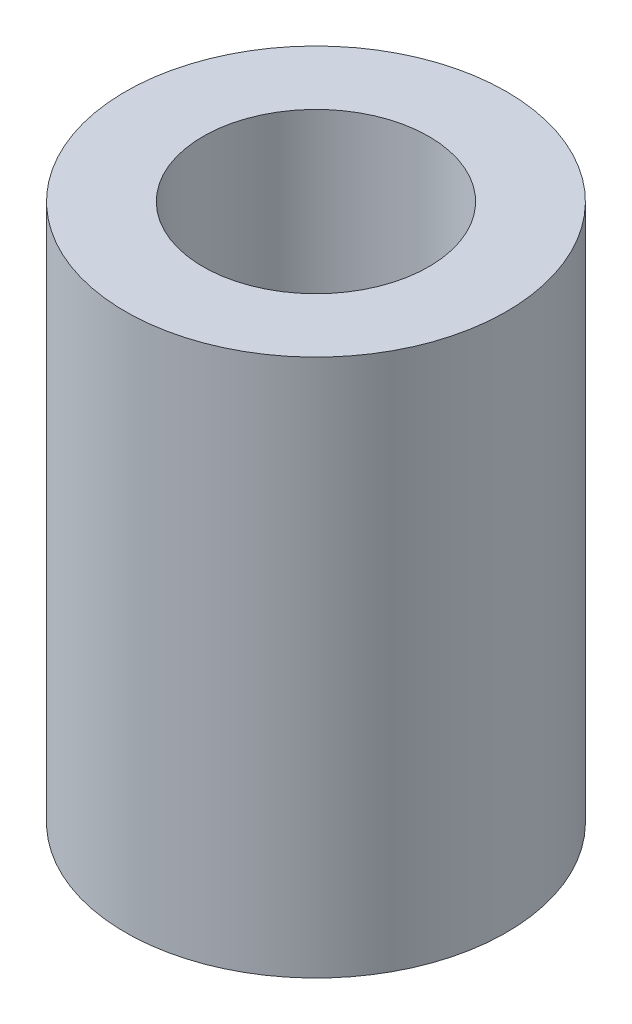
ISO-10303-21;
HEADER;
FILE_DESCRIPTION(('STEP AP214'),'2;1');
FILE_NAME('part.step','',(''),(''),'','','');
FILE_SCHEMA(('AUTOMOTIVE_DESIGN { 1 0 10303 214 1 1 1 1 }'));
ENDSEC;
DATA;
#1=APPLICATION_CONTEXT('core data for automotive mechanical design processes');
#2=APPLICATION_PROTOCOL_DEFINITION('international standard','automotive_design',2000,#1);
#3=PRODUCT_CONTEXT('',#1,'mechanical');
#4=PRODUCT('Part','Part','',(#3));
#5=PRODUCT_RELATED_PRODUCT_CATEGORY('part','',(#4));
#6=PRODUCT_DEFINITION_FORMATION('','',#4);
#7=PRODUCT_DEFINITION_CONTEXT('part definition',#1,'design');
#8=PRODUCT_DEFINITION('design','',#6,#7);
#9=PRODUCT_DEFINITION_SHAPE('','',#8);
#10=(LENGTH_UNIT() NAMED_UNIT(*) SI_UNIT(.MILLI.,.METRE.));
#11=(NAMED_UNIT(*) PLANE_ANGLE_UNIT() SI_UNIT($,.RADIAN.));
#12=(NAMED_UNIT(*) SI_UNIT($,.STERADIAN.) SOLID_ANGLE_UNIT());
#13=UNCERTAINTY_MEASURE_WITH_UNIT(LENGTH_MEASURE(1.E-05),#10,'distance_accuracy_value','');
#14=(GEOMETRIC_REPRESENTATION_CONTEXT(3) GLOBAL_UNCERTAINTY_ASSIGNED_CONTEXT((#13)) GLOBAL_UNIT_ASSIGNED_CONTEXT((#10,
#11,#12)) REPRESENTATION_CONTEXT('',''));
#15=CARTESIAN_POINT('',(0.,0.,0.));
#16=DIRECTION('',(0.,0.,1.));
#17=DIRECTION('',(1.,0.,0.));
#18=AXIS2_PLACEMENT_3D('',#15,#16,#17);
#19=CARTESIAN_POINT('',(0.,7.62,0.));
#20=DIRECTION('',(0.,1.,0.));
#21=DIRECTION('',(0.,0.,1.));
#22=AXIS2_PLACEMENT_3D('',#19,#20,#21);
#23=PLANE('',#22);
#24=CARTESIAN_POINT('',(0.,7.62,0.));
#25=DIRECTION('',(0.,1.,0.));
#26=DIRECTION('',(0.,0.,1.));
#27=AXIS2_PLACEMENT_3D('',#24,#25,#26);
#28=CIRCLE('',#27,2.7);
#29=CARTESIAN_POINT('',(0.,7.62,-2.7));
#30=VERTEX_POINT('',#29);
#31=EDGE_CURVE('E10',#30,#30,#28,.T.);
#32=ORIENTED_EDGE('',*,*,#31,.T.);
#33=EDGE_LOOP('',(#32));
#34=FACE_BOUND('',#33,.T.);
#35=CARTESIAN_POINT('',(0.,7.62,0.));
#36=DIRECTION('',(0.,1.,0.));
#37=DIRECTION('',(0.,0.,1.));
#38=AXIS2_PLACEMENT_3D('',#35,#36,#37);
#39=CIRCLE('',#38,1.6);
#40=CARTESIAN_POINT('',(0.,7.62,-1.6));
#41=VERTEX_POINT('',#40);
#42=EDGE_CURVE('E56',#41,#41,#39,.T.);
#43=ORIENTED_EDGE('',*,*,#42,.F.);
#44=EDGE_LOOP('',(#43));
#45=FACE_BOUND('',#44,.T.);
#46=ADVANCED_FACE('F43',(#34,#45),#23,.T.);
#47=CARTESIAN_POINT('',(0.,0.,0.));
#48=DIRECTION('',(0.,1.,0.));
#49=DIRECTION('',(0.,0.,1.));
#50=AXIS2_PLACEMENT_3D('',#47,#48,#49);
#51=PLANE('',#50);
#52=CARTESIAN_POINT('',(0.,0.,0.));
#53=DIRECTION('',(0.,1.,0.));
#54=DIRECTION('',(0.,0.,1.));
#55=AXIS2_PLACEMENT_3D('',#52,#53,#54);
#56=CIRCLE('',#55,2.7);
#57=CARTESIAN_POINT('',(0.,0.,-2.7));
#58=VERTEX_POINT('',#57);
#59=EDGE_CURVE('E47',#58,#58,#56,.T.);
#60=ORIENTED_EDGE('',*,*,#59,.F.);
#61=EDGE_LOOP('',(#60));
#62=FACE_BOUND('',#61,.T.);
#63=CARTESIAN_POINT('',(0.,0.,0.));
#64=DIRECTION('',(0.,1.,0.));
#65=DIRECTION('',(0.,0.,1.));
#66=AXIS2_PLACEMENT_3D('',#63,#64,#65);
#67=CIRCLE('',#66,1.6);
#68=CARTESIAN_POINT('',(0.,0.,-1.6));
#69=VERTEX_POINT('',#68);
#70=EDGE_CURVE('E58',#69,#69,#67,.T.);
#71=ORIENTED_EDGE('',*,*,#70,.T.);
#72=EDGE_LOOP('',(#71));
#73=FACE_BOUND('',#72,.T.);
#74=ADVANCED_FACE('F70',(#62,#73),#51,.F.);
#75=CARTESIAN_POINT('',(0.,7.62,0.));
#76=DIRECTION('',(0.,-1.,0.));
#77=DIRECTION('',(0.,0.,-1.));
#78=AXIS2_PLACEMENT_3D('',#75,#76,#77);
#79=CYLINDRICAL_SURFACE('',#78,2.7);
#80=CARTESIAN_POINT('',(0.,7.62,-2.7));
#81=CARTESIAN_POINT('',(0.,7.540625,-2.7));
#82=CARTESIAN_POINT('',(0.,7.46125,-2.7));
#83=CARTESIAN_POINT('',(0.,7.3025,-2.7));
#84=CARTESIAN_POINT('',(0.,7.223125,-2.7));
#85=CARTESIAN_POINT('',(0.,7.064375,-2.7));
#86=CARTESIAN_POINT('',(0.,6.985,-2.7));
#87=CARTESIAN_POINT('',(0.,6.82625,-2.7));
#88=CARTESIAN_POINT('',(0.,6.746875,-2.7));
#89=CARTESIAN_POINT('',(0.,6.588125,-2.7));
#90=CARTESIAN_POINT('',(0.,6.50875,-2.7));
#91=CARTESIAN_POINT('',(0.,6.35,-2.7));
#92=CARTESIAN_POINT('',(0.,6.270625,-2.7));
#93=CARTESIAN_POINT('',(0.,6.111875,-2.7));
#94=CARTESIAN_POINT('',(0.,6.0325,-2.7));
#95=CARTESIAN_POINT('',(0.,5.87375,-2.7));
#96=CARTESIAN_POINT('',(0.,5.794375,-2.7));
#97=CARTESIAN_POINT('',(0.,5.635625,-2.7));
#98=CARTESIAN_POINT('',(0.,5.55625,-2.7));
#99=CARTESIAN_POINT('',(0.,5.3975,-2.7));
#100=CARTESIAN_POINT('',(0.,5.318125,-2.7));
#101=CARTESIAN_POINT('',(0.,5.159375,-2.7));
#102=CARTESIAN_POINT('',(0.,5.08,-2.7));
#103=CARTESIAN_POINT('',(0.,4.92125,-2.7));
#104=CARTESIAN_POINT('',(0.,4.841875,-2.7));
#105=CARTESIAN_POINT('',(0.,4.683125,-2.7));
#106=CARTESIAN_POINT('',(0.,4.60375,-2.7));
#107=CARTESIAN_POINT('',(0.,4.445,-2.7));
#108=CARTESIAN_POINT('',(0.,4.365625,-2.7));
#109=CARTESIAN_POINT('',(0.,4.206875,-2.7));
#110=CARTESIAN_POINT('',(0.,4.1275,-2.7));
#111=CARTESIAN_POINT('',(0.,3.96875,-2.7));
#112=CARTESIAN_POINT('',(0.,3.889375,-2.7));
#113=CARTESIAN_POINT('',(0.,3.730625,-2.7));
#114=CARTESIAN_POINT('',(0.,3.65125,-2.7));
#115=CARTESIAN_POINT('',(0.,3.4925,-2.7));
#116=CARTESIAN_POINT('',(0.,3.413125,-2.7));
#117=CARTESIAN_POINT('',(0.,3.254375,-2.7));
#118=CARTESIAN_POINT('',(0.,3.175,-2.7));
#119=CARTESIAN_POINT('',(0.,3.01625,-2.7));
#120=CARTESIAN_POINT('',(0.,2.936875,-2.7));
#121=CARTESIAN_POINT('',(0.,2.778125,-2.7));
#122=CARTESIAN_POINT('',(0.,2.69875,-2.7));
#123=CARTESIAN_POINT('',(0.,2.54,-2.7));
#124=CARTESIAN_POINT('',(0.,2.460625,-2.7));
#125=CARTESIAN_POINT('',(0.,2.301875,-2.7));
#126=CARTESIAN_POINT('',(0.,2.2225,-2.7));
#127=CARTESIAN_POINT('',(0.,2.06375,-2.7));
#128=CARTESIAN_POINT('',(0.,1.984375,-2.7));
#129=CARTESIAN_POINT('',(0.,1.825625,-2.7));
#130=CARTESIAN_POINT('',(0.,1.74625,-2.7));
#131=CARTESIAN_POINT('',(0.,1.5875,-2.7));
#132=CARTESIAN_POINT('',(0.,1.508125,-2.7));
#133=CARTESIAN_POINT('',(0.,1.349375,-2.7));
#134=CARTESIAN_POINT('',(0.,1.27,-2.7));
#135=CARTESIAN_POINT('',(0.,1.11125,-2.7));
#136=CARTESIAN_POINT('',(0.,1.031875,-2.7));
#137=CARTESIAN_POINT('',(0.,0.873125,-2.7));
#138=CARTESIAN_POINT('',(0.,0.79375,-2.7));
#139=CARTESIAN_POINT('',(0.,0.635,-2.7));
#140=CARTESIAN_POINT('',(0.,0.555625,-2.7));
#141=CARTESIAN_POINT('',(0.,0.396875,-2.7));
#142=CARTESIAN_POINT('',(0.,0.3175,-2.7));
#143=CARTESIAN_POINT('',(0.,0.15875,-2.7));
#144=CARTESIAN_POINT('',(0.,0.0793749999999999,-2.7));
#145=CARTESIAN_POINT('',(0.,0.,-2.7));
#146=B_SPLINE_CURVE_WITH_KNOTS('',3,(#80,#81,#82,#83,#84,#85,#86,#87,#88,#89,#90,#91,#92,#93,
#94,#95,#96,#97,#98,#99,#100,#101,#102,#103,#104,#105,#106,#107,#108,#109,#110,#111,#112,#113,
#114,#115,#116,#117,#118,#119,#120,#121,#122,#123,#124,#125,#126,#127,#128,#129,#130,#131,#132,
#133,#134,#135,#136,#137,#138,#139,#140,#141,#142,#143,#144,#145),.UNSPECIFIED.,.F.,.F.,(4,2,2,
2,2,2,2,2,2,2,2,2,2,2,2,2,2,2,2,2,2,2,2,2,2,2,2,2,2,2,2,2,4),(0.,0.238125,0.47625,
0.714375000000001,0.9525,1.190625,1.42875,1.666875,1.905,2.143125,2.38125,2.619375,2.8575,
3.095625,3.33375,3.571875,3.81,4.048125,4.28625,4.524375,4.7625,5.000625,5.23875,5.476875,5.715,
5.953125,6.19125,6.429375,6.6675,6.905625,7.14375,7.381875,7.62),.UNSPECIFIED.);
#147=EDGE_CURVE('BSEAM45',#30,#58,#146,.T.);
#148=ORIENTED_EDGE('',*,*,#31,.F.);
#149=ORIENTED_EDGE('',*,*,#59,.T.);
#150=ORIENTED_EDGE('',*,*,#147,.T.);
#151=ORIENTED_EDGE('',*,*,#147,.F.);
#152=EDGE_LOOP('',(#148,#150,#149,#151));
#153=FACE_BOUND('',#152,.T.);
#154=ADVANCED_FACE('F45',(#153),#79,.T.);
#155=CARTESIAN_POINT('',(0.,7.62,0.));
#156=DIRECTION('',(0.,-1.,0.));
#157=DIRECTION('',(0.,0.,-1.));
#158=AXIS2_PLACEMENT_3D('',#155,#156,#157);
#159=CYLINDRICAL_SURFACE('',#158,1.6);
#160=CARTESIAN_POINT('',(0.,7.62,-1.6));
#161=CARTESIAN_POINT('',(0.,7.540625,-1.6));
#162=CARTESIAN_POINT('',(0.,7.46125,-1.6));
#163=CARTESIAN_POINT('',(0.,7.3025,-1.6));
#164=CARTESIAN_POINT('',(0.,7.223125,-1.6));
#165=CARTESIAN_POINT('',(0.,7.064375,-1.6));
#166=CARTESIAN_POINT('',(0.,6.985,-1.6));
#167=CARTESIAN_POINT('',(0.,6.82625,-1.6));
#168=CARTESIAN_POINT('',(0.,6.746875,-1.6));
#169=CARTESIAN_POINT('',(0.,6.588125,-1.6));
#170=CARTESIAN_POINT('',(0.,6.50875,-1.6));
#171=CARTESIAN_POINT('',(0.,6.35,-1.6));
#172=CARTESIAN_POINT('',(0.,6.270625,-1.6));
#173=CARTESIAN_POINT('',(0.,6.111875,-1.6));
#174=CARTESIAN_POINT('',(0.,6.0325,-1.6));
#175=CARTESIAN_POINT('',(0.,5.87375,-1.6));
#176=CARTESIAN_POINT('',(0.,5.794375,-1.6));
#177=CARTESIAN_POINT('',(0.,5.635625,-1.6));
#178=CARTESIAN_POINT('',(0.,5.55625,-1.6));
#179=CARTESIAN_POINT('',(0.,5.3975,-1.6));
#180=CARTESIAN_POINT('',(0.,5.318125,-1.6));
#181=CARTESIAN_POINT('',(0.,5.159375,-1.6));
#182=CARTESIAN_POINT('',(0.,5.08,-1.6));
#183=CARTESIAN_POINT('',(0.,4.92125,-1.6));
#184=CARTESIAN_POINT('',(0.,4.841875,-1.6));
#185=CARTESIAN_POINT('',(0.,4.683125,-1.6));
#186=CARTESIAN_POINT('',(0.,4.60375,-1.6));
#187=CARTESIAN_POINT('',(0.,4.445,-1.6));
#188=CARTESIAN_POINT('',(0.,4.365625,-1.6));
#189=CARTESIAN_POINT('',(0.,4.206875,-1.6));
#190=CARTESIAN_POINT('',(0.,4.1275,-1.6));
#191=CARTESIAN_POINT('',(0.,3.96875,-1.6));
#192=CARTESIAN_POINT('',(0.,3.889375,-1.6));
#193=CARTESIAN_POINT('',(0.,3.730625,-1.6));
#194=CARTESIAN_POINT('',(0.,3.65125,-1.6));
#195=CARTESIAN_POINT('',(0.,3.4925,-1.6));
#196=CARTESIAN_POINT('',(0.,3.413125,-1.6));
#197=CARTESIAN_POINT('',(0.,3.254375,-1.6));
#198=CARTESIAN_POINT('',(0.,3.175,-1.6));
#199=CARTESIAN_POINT('',(0.,3.01625,-1.6));
#200=CARTESIAN_POINT('',(0.,2.936875,-1.6));
#201=CARTESIAN_POINT('',(0.,2.778125,-1.6));
#202=CARTESIAN_POINT('',(0.,2.69875,-1.6));
#203=CARTESIAN_POINT('',(0.,2.54,-1.6));
#204=CARTESIAN_POINT('',(0.,2.460625,-1.6));
#205=CARTESIAN_POINT('',(0.,2.301875,-1.6));
#206=CARTESIAN_POINT('',(0.,2.2225,-1.6));
#207=CARTESIAN_POINT('',(0.,2.06375,-1.6));
#208=CARTESIAN_POINT('',(0.,1.984375,-1.6));
#209=CARTESIAN_POINT('',(0.,1.825625,-1.6));
#210=CARTESIAN_POINT('',(0.,1.74625,-1.6));
#211=CARTESIAN_POINT('',(0.,1.5875,-1.6));
#212=CARTESIAN_POINT('',(0.,1.508125,-1.6));
#213=CARTESIAN_POINT('',(0.,1.349375,-1.6));
#214=CARTESIAN_POINT('',(0.,1.27,-1.6));
#215=CARTESIAN_POINT('',(0.,1.11125,-1.6));
#216=CARTESIAN_POINT('',(0.,1.031875,-1.6));
#217=CARTESIAN_POINT('',(0.,0.873125,-1.6));
#218=CARTESIAN_POINT('',(0.,0.79375,-1.6));
#219=CARTESIAN_POINT('',(0.,0.635,-1.6));
#220=CARTESIAN_POINT('',(0.,0.555625,-1.6));
#221=CARTESIAN_POINT('',(0.,0.396875,-1.6));
#222=CARTESIAN_POINT('',(0.,0.3175,-1.6));
#223=CARTESIAN_POINT('',(0.,0.15875,-1.6));
#224=CARTESIAN_POINT('',(0.,0.0793749999999999,-1.6));
#225=CARTESIAN_POINT('',(0.,0.,-1.6));
#226=B_SPLINE_CURVE_WITH_KNOTS('',3,(#160,#161,#162,#163,#164,#165,#166,#167,#168,#169,#170,
#171,#172,#173,#174,#175,#176,#177,#178,#179,#180,#181,#182,#183,#184,#185,#186,#187,#188,#189,
#190,#191,#192,#193,#194,#195,#196,#197,#198,#199,#200,#201,#202,#203,#204,#205,#206,#207,#208,
#209,#210,#211,#212,#213,#214,#215,#216,#217,#218,#219,#220,#221,#222,#223,#224,#225),
.UNSPECIFIED.,.F.,.F.,(4,2,2,2,2,2,2,2,2,2,2,2,2,2,2,2,2,2,2,2,2,2,2,2,2,2,2,2,2,2,2,2,4),(0.,
0.238125,0.47625,0.714375000000001,0.9525,1.190625,1.42875,1.666875,1.905,2.143125,2.38125,
2.619375,2.8575,3.095625,3.33375,3.571875,3.81,4.048125,4.28625,4.524375,4.7625,5.000625,
5.23875,5.476875,5.715,5.953125,6.19125,6.429375,6.6675,6.905625,7.14375,7.381875,7.62),.UNSPECIFIED.);
#227=EDGE_CURVE('BSEAM66',#41,#69,#226,.T.);
#228=ORIENTED_EDGE('',*,*,#42,.T.);
#229=ORIENTED_EDGE('',*,*,#70,.F.);
#230=ORIENTED_EDGE('',*,*,#227,.T.);
#231=ORIENTED_EDGE('',*,*,#227,.F.);
#232=EDGE_LOOP('',(#228,#230,#229,#231));
#233=FACE_BOUND('',#232,.T.);
#234=ADVANCED_FACE('F66',(#233),#159,.F.);
#235=CLOSED_SHELL('',(#46,#74,#154,#234));
#236=MANIFOLD_SOLID_BREP('B2',#235);
#237=ADVANCED_BREP_SHAPE_REPRESENTATION('',(#18,#236),#14);
#238=SHAPE_DEFINITION_REPRESENTATION(#9,#237);
ENDSEC;
END-ISO-10303-21;
